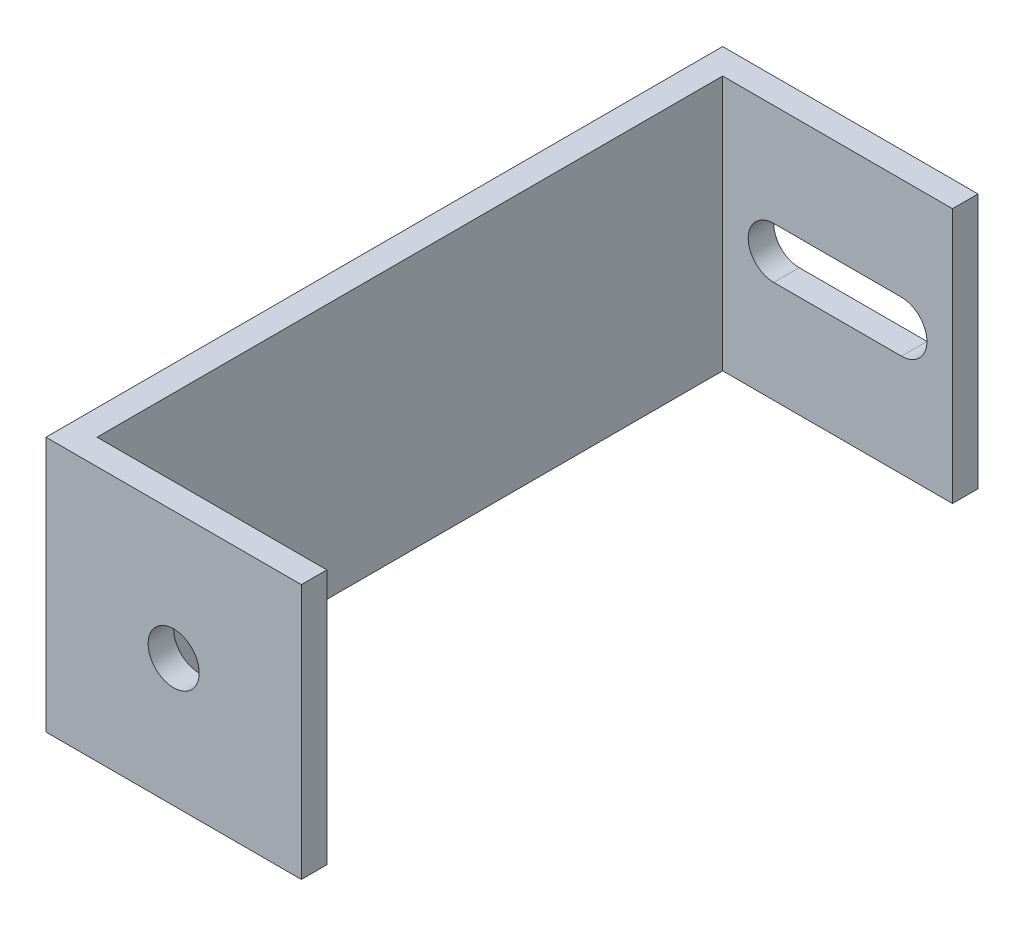
ISO-10303-21;
HEADER;
FILE_DESCRIPTION(('STEP AP214'),'2;1');
FILE_NAME('part.step','',(''),(''),'','','');
FILE_SCHEMA(('AUTOMOTIVE_DESIGN { 1 0 10303 214 1 1 1 1 }'));
ENDSEC;
DATA;
#1=APPLICATION_CONTEXT('core data for automotive mechanical design processes');
#2=APPLICATION_PROTOCOL_DEFINITION('international standard','automotive_design',2000,#1);
#3=PRODUCT_CONTEXT('',#1,'mechanical');
#4=PRODUCT('Part','Part','',(#3));
#5=PRODUCT_RELATED_PRODUCT_CATEGORY('part','',(#4));
#6=PRODUCT_DEFINITION_FORMATION('','',#4);
#7=PRODUCT_DEFINITION_CONTEXT('part definition',#1,'design');
#8=PRODUCT_DEFINITION('design','',#6,#7);
#9=PRODUCT_DEFINITION_SHAPE('','',#8);
#10=(LENGTH_UNIT() NAMED_UNIT(*) SI_UNIT(.MILLI.,.METRE.));
#11=(NAMED_UNIT(*) PLANE_ANGLE_UNIT() SI_UNIT($,.RADIAN.));
#12=(NAMED_UNIT(*) SI_UNIT($,.STERADIAN.) SOLID_ANGLE_UNIT());
#13=UNCERTAINTY_MEASURE_WITH_UNIT(LENGTH_MEASURE(1.E-05),#10,'distance_accuracy_value','');
#14=(GEOMETRIC_REPRESENTATION_CONTEXT(3) GLOBAL_UNCERTAINTY_ASSIGNED_CONTEXT((#13)) GLOBAL_UNIT_ASSIGNED_CONTEXT((#10,
#11,#12)) REPRESENTATION_CONTEXT('',''));
#15=CARTESIAN_POINT('',(0.,0.,0.));
#16=DIRECTION('',(0.,0.,1.));
#17=DIRECTION('',(1.,0.,0.));
#18=AXIS2_PLACEMENT_3D('',#15,#16,#17);
#19=CARTESIAN_POINT('',(-8.,10.,53.));
#20=DIRECTION('',(-1.,0.,0.));
#21=DIRECTION('',(0.,-1.,0.));
#22=AXIS2_PLACEMENT_3D('',#19,#20,#21);
#23=PLANE('',#22);
#24=DIRECTION('',(0.,1.,0.));
#25=VECTOR('',#24,1.);
#26=CARTESIAN_POINT('',(-8.,10.,51.));
#27=LINE('',#26,#25);
#28=CARTESIAN_POINT('',(-8.,-10.,51.));
#29=VERTEX_POINT('',#28);
#30=CARTESIAN_POINT('',(-8.,10.,51.));
#31=VERTEX_POINT('',#30);
#32=EDGE_CURVE('E166',#29,#31,#27,.T.);
#33=ORIENTED_EDGE('',*,*,#32,.F.);
#34=DIRECTION('',(0.,0.,-1.));
#35=VECTOR('',#34,1.);
#36=CARTESIAN_POINT('',(-8.,-10.,53.));
#37=LINE('',#36,#35);
#38=CARTESIAN_POINT('',(-8.,-10.,2.));
#39=VERTEX_POINT('',#38);
#40=EDGE_CURVE('E192',#29,#39,#37,.T.);
#41=ORIENTED_EDGE('',*,*,#40,.T.);
#42=DIRECTION('',(0.,1.,0.));
#43=VECTOR('',#42,1.);
#44=CARTESIAN_POINT('',(-8.,10.,2.));
#45=LINE('',#44,#43);
#46=CARTESIAN_POINT('',(-8.,10.,2.));
#47=VERTEX_POINT('',#46);
#48=EDGE_CURVE('E179',#39,#47,#45,.T.);
#49=ORIENTED_EDGE('',*,*,#48,.T.);
#50=DIRECTION('',(0.,0.,-1.));
#51=VECTOR('',#50,1.);
#52=CARTESIAN_POINT('',(-8.,10.,53.));
#53=LINE('',#52,#51);
#54=EDGE_CURVE('E188',#31,#47,#53,.T.);
#55=ORIENTED_EDGE('',*,*,#54,.F.);
#56=EDGE_LOOP('',(#33,#41,#49,#55));
#57=FACE_BOUND('',#56,.T.);
#58=ADVANCED_FACE('F34',(#57),#23,.F.);
#59=CARTESIAN_POINT('',(10.,10.,2.));
#60=DIRECTION('',(-1.,0.,0.));
#61=DIRECTION('',(0.,-1.,0.));
#62=AXIS2_PLACEMENT_3D('',#59,#60,#61);
#63=PLANE('',#62);
#64=DIRECTION('',(0.,1.,0.));
#65=VECTOR('',#64,1.);
#66=CARTESIAN_POINT('',(10.,10.,0.));
#67=LINE('',#66,#65);
#68=CARTESIAN_POINT('',(10.,-10.,0.));
#69=VERTEX_POINT('',#68);
#70=CARTESIAN_POINT('',(10.,10.,0.));
#71=VERTEX_POINT('',#70);
#72=EDGE_CURVE('E194',#69,#71,#67,.T.);
#73=ORIENTED_EDGE('',*,*,#72,.T.);
#74=DIRECTION('',(0.,0.,-1.));
#75=VECTOR('',#74,1.);
#76=CARTESIAN_POINT('',(10.,10.,2.));
#77=LINE('',#76,#75);
#78=CARTESIAN_POINT('',(10.,10.,2.));
#79=VERTEX_POINT('',#78);
#80=EDGE_CURVE('E11',#79,#71,#77,.T.);
#81=ORIENTED_EDGE('',*,*,#80,.F.);
#82=DIRECTION('',(0.,1.,0.));
#83=VECTOR('',#82,1.);
#84=CARTESIAN_POINT('',(10.,10.,2.));
#85=LINE('',#84,#83);
#86=CARTESIAN_POINT('',(10.,-10.,2.));
#87=VERTEX_POINT('',#86);
#88=EDGE_CURVE('E195',#87,#79,#85,.T.);
#89=ORIENTED_EDGE('',*,*,#88,.F.);
#90=DIRECTION('',(0.,0.,-1.));
#91=VECTOR('',#90,1.);
#92=CARTESIAN_POINT('',(10.,-10.,2.));
#93=LINE('',#92,#91);
#94=EDGE_CURVE('E204',#87,#69,#93,.T.);
#95=ORIENTED_EDGE('',*,*,#94,.T.);
#96=EDGE_LOOP('',(#73,#81,#89,#95));
#97=FACE_BOUND('',#96,.T.);
#98=ADVANCED_FACE('F36',(#97),#63,.F.);
#99=CARTESIAN_POINT('',(-10.,10.,2.));
#100=DIRECTION('',(0.,-1.,0.));
#101=DIRECTION('',(0.,0.,-1.));
#102=AXIS2_PLACEMENT_3D('',#99,#100,#101);
#103=PLANE('',#102);
#104=DIRECTION('',(-1.,0.,0.));
#105=VECTOR('',#104,1.);
#106=CARTESIAN_POINT('',(-10.,10.,0.));
#107=LINE('',#106,#105);
#108=CARTESIAN_POINT('',(-10.,10.,0.));
#109=VERTEX_POINT('',#108);
#110=EDGE_CURVE('E207',#71,#109,#107,.T.);
#111=ORIENTED_EDGE('',*,*,#110,.T.);
#112=DIRECTION('',(0.,0.,-1.));
#113=VECTOR('',#112,1.);
#114=CARTESIAN_POINT('',(-10.,10.,2.));
#115=LINE('',#114,#113);
#116=CARTESIAN_POINT('',(-10.,10.,53.));
#117=VERTEX_POINT('',#116);
#118=EDGE_CURVE('E43',#117,#109,#115,.T.);
#119=ORIENTED_EDGE('',*,*,#118,.F.);
#120=DIRECTION('',(-1.,0.,0.));
#121=VECTOR('',#120,1.);
#122=CARTESIAN_POINT('',(-10.,10.,53.));
#123=LINE('',#122,#121);
#124=CARTESIAN_POINT('',(10.,10.,53.));
#125=VERTEX_POINT('',#124);
#126=EDGE_CURVE('E185',#125,#117,#123,.T.);
#127=ORIENTED_EDGE('',*,*,#126,.F.);
#128=DIRECTION('',(0.,0.,1.));
#129=VECTOR('',#128,1.);
#130=CARTESIAN_POINT('',(10.,10.,53.));
#131=LINE('',#130,#129);
#132=CARTESIAN_POINT('',(10.,10.,51.));
#133=VERTEX_POINT('',#132);
#134=EDGE_CURVE('E170',#133,#125,#131,.T.);
#135=ORIENTED_EDGE('',*,*,#134,.F.);
#136=DIRECTION('',(-1.,0.,0.));
#137=VECTOR('',#136,1.);
#138=CARTESIAN_POINT('',(10.,10.,51.));
#139=LINE('',#138,#137);
#140=EDGE_CURVE('E173',#133,#31,#139,.T.);
#141=ORIENTED_EDGE('',*,*,#140,.T.);
#142=ORIENTED_EDGE('',*,*,#54,.T.);
#143=DIRECTION('',(-1.,0.,0.));
#144=VECTOR('',#143,1.);
#145=CARTESIAN_POINT('',(-10.,10.,2.));
#146=LINE('',#145,#144);
#147=EDGE_CURVE('E198',#79,#47,#146,.T.);
#148=ORIENTED_EDGE('',*,*,#147,.F.);
#149=ORIENTED_EDGE('',*,*,#80,.T.);
#150=EDGE_LOOP('',(#111,#119,#127,#135,#141,#142,#148,#149));
#151=FACE_BOUND('',#150,.T.);
#152=ADVANCED_FACE('F247',(#151),#103,.F.);
#153=CARTESIAN_POINT('',(-10.,10.,2.));
#154=DIRECTION('',(1.,0.,0.));
#155=DIRECTION('',(0.,1.,0.));
#156=AXIS2_PLACEMENT_3D('',#153,#154,#155);
#157=PLANE('',#156);
#158=DIRECTION('',(0.,-1.,0.));
#159=VECTOR('',#158,1.);
#160=CARTESIAN_POINT('',(-10.,10.,0.));
#161=LINE('',#160,#159);
#162=CARTESIAN_POINT('',(-10.,-10.,0.));
#163=VERTEX_POINT('',#162);
#164=EDGE_CURVE('E209',#109,#163,#161,.T.);
#165=ORIENTED_EDGE('',*,*,#164,.T.);
#166=DIRECTION('',(0.,0.,-1.));
#167=VECTOR('',#166,1.);
#168=CARTESIAN_POINT('',(-10.,-10.,2.));
#169=LINE('',#168,#167);
#170=CARTESIAN_POINT('',(-10.,-10.,53.));
#171=VERTEX_POINT('',#170);
#172=EDGE_CURVE('E214',#171,#163,#169,.T.);
#173=ORIENTED_EDGE('',*,*,#172,.F.);
#174=DIRECTION('',(0.,-1.,0.));
#175=VECTOR('',#174,1.);
#176=CARTESIAN_POINT('',(-10.,10.,53.));
#177=LINE('',#176,#175);
#178=EDGE_CURVE('E180',#117,#171,#177,.T.);
#179=ORIENTED_EDGE('',*,*,#178,.F.);
#180=ORIENTED_EDGE('',*,*,#118,.T.);
#181=EDGE_LOOP('',(#165,#173,#179,#180));
#182=FACE_BOUND('',#181,.T.);
#183=ADVANCED_FACE('F221',(#182),#157,.F.);
#184=CARTESIAN_POINT('',(-10.,-10.,2.));
#185=DIRECTION('',(0.,1.,0.));
#186=DIRECTION('',(0.,0.,1.));
#187=AXIS2_PLACEMENT_3D('',#184,#185,#186);
#188=PLANE('',#187);
#189=DIRECTION('',(1.,0.,0.));
#190=VECTOR('',#189,1.);
#191=CARTESIAN_POINT('',(-10.,-10.,0.));
#192=LINE('',#191,#190);
#193=EDGE_CURVE('E199',#163,#69,#192,.T.);
#194=ORIENTED_EDGE('',*,*,#193,.T.);
#195=ORIENTED_EDGE('',*,*,#94,.F.);
#196=DIRECTION('',(1.,0.,0.));
#197=VECTOR('',#196,1.);
#198=CARTESIAN_POINT('',(-10.,-10.,2.));
#199=LINE('',#198,#197);
#200=EDGE_CURVE('E202',#39,#87,#199,.T.);
#201=ORIENTED_EDGE('',*,*,#200,.F.);
#202=ORIENTED_EDGE('',*,*,#40,.F.);
#203=DIRECTION('',(-1.,0.,0.));
#204=VECTOR('',#203,1.);
#205=CARTESIAN_POINT('',(10.,-10.,51.));
#206=LINE('',#205,#204);
#207=CARTESIAN_POINT('',(10.,-10.,51.));
#208=VERTEX_POINT('',#207);
#209=EDGE_CURVE('E177',#208,#29,#206,.T.);
#210=ORIENTED_EDGE('',*,*,#209,.F.);
#211=DIRECTION('',(0.,0.,-1.));
#212=VECTOR('',#211,1.);
#213=CARTESIAN_POINT('',(10.,-10.,53.));
#214=LINE('',#213,#212);
#215=CARTESIAN_POINT('',(10.,-10.,53.));
#216=VERTEX_POINT('',#215);
#217=EDGE_CURVE('E165',#216,#208,#214,.T.);
#218=ORIENTED_EDGE('',*,*,#217,.F.);
#219=DIRECTION('',(1.,0.,0.));
#220=VECTOR('',#219,1.);
#221=CARTESIAN_POINT('',(-10.,-10.,53.));
#222=LINE('',#221,#220);
#223=EDGE_CURVE('E183',#171,#216,#222,.T.);
#224=ORIENTED_EDGE('',*,*,#223,.F.);
#225=ORIENTED_EDGE('',*,*,#172,.T.);
#226=EDGE_LOOP('',(#194,#195,#201,#202,#210,#218,#224,#225));
#227=FACE_BOUND('',#226,.T.);
#228=ADVANCED_FACE('F227',(#227),#188,.F.);
#229=CARTESIAN_POINT('',(0.,0.,2.));
#230=DIRECTION('',(0.,0.,1.));
#231=DIRECTION('',(1.,0.,0.));
#232=AXIS2_PLACEMENT_3D('',#229,#230,#231);
#233=PLANE('',#232);
#234=CARTESIAN_POINT('',(6.,0.,2.));
#235=DIRECTION('',(0.,0.,1.));
#236=DIRECTION('',(1.,0.,0.));
#237=AXIS2_PLACEMENT_3D('',#234,#235,#236);
#238=CIRCLE('',#237,2.);
#239=CARTESIAN_POINT('',(6.,-2.,2.));
#240=VERTEX_POINT('',#239);
#241=CARTESIAN_POINT('',(6.,2.,2.));
#242=VERTEX_POINT('',#241);
#243=EDGE_CURVE('E157',#240,#242,#238,.T.);
#244=ORIENTED_EDGE('',*,*,#243,.F.);
#245=DIRECTION('',(1.,0.,0.));
#246=VECTOR('',#245,1.);
#247=CARTESIAN_POINT('',(0.,-2.,2.));
#248=LINE('',#247,#246);
#249=CARTESIAN_POINT('',(-4.,-2.,2.));
#250=VERTEX_POINT('',#249);
#251=EDGE_CURVE('E150',#250,#240,#248,.T.);
#252=ORIENTED_EDGE('',*,*,#251,.F.);
#253=CARTESIAN_POINT('',(-4.,0.,2.));
#254=DIRECTION('',(0.,0.,1.));
#255=DIRECTION('',(1.,0.,0.));
#256=AXIS2_PLACEMENT_3D('',#253,#254,#255);
#257=CIRCLE('',#256,2.);
#258=CARTESIAN_POINT('',(-4.,2.,2.));
#259=VERTEX_POINT('',#258);
#260=EDGE_CURVE('E130',#259,#250,#257,.T.);
#261=ORIENTED_EDGE('',*,*,#260,.F.);
#262=DIRECTION('',(-1.,0.,0.));
#263=VECTOR('',#262,1.);
#264=CARTESIAN_POINT('',(0.,2.,2.));
#265=LINE('',#264,#263);
#266=EDGE_CURVE('E155',#242,#259,#265,.T.);
#267=ORIENTED_EDGE('',*,*,#266,.F.);
#268=EDGE_LOOP('',(#244,#252,#261,#267));
#269=FACE_BOUND('',#268,.T.);
#270=ORIENTED_EDGE('',*,*,#48,.F.);
#271=ORIENTED_EDGE('',*,*,#200,.T.);
#272=ORIENTED_EDGE('',*,*,#88,.T.);
#273=ORIENTED_EDGE('',*,*,#147,.T.);
#274=EDGE_LOOP('',(#270,#271,#272,#273));
#275=FACE_BOUND('',#274,.T.);
#276=ADVANCED_FACE('F235',(#269,#275),#233,.T.);
#277=CARTESIAN_POINT('',(0.,0.,0.));
#278=DIRECTION('',(0.,0.,1.));
#279=DIRECTION('',(1.,0.,0.));
#280=AXIS2_PLACEMENT_3D('',#277,#278,#279);
#281=PLANE('',#280);
#282=DIRECTION('',(-1.,0.,0.));
#283=VECTOR('',#282,1.);
#284=CARTESIAN_POINT('',(6.,-2.,0.));
#285=LINE('',#284,#283);
#286=CARTESIAN_POINT('',(6.,-2.,0.));
#287=VERTEX_POINT('',#286);
#288=CARTESIAN_POINT('',(-4.,-2.,0.));
#289=VERTEX_POINT('',#288);
#290=EDGE_CURVE('E136',#287,#289,#285,.T.);
#291=ORIENTED_EDGE('',*,*,#290,.F.);
#292=CARTESIAN_POINT('',(6.,0.,0.));
#293=DIRECTION('',(0.,0.,-1.));
#294=DIRECTION('',(-1.,0.,0.));
#295=AXIS2_PLACEMENT_3D('',#292,#293,#294);
#296=CIRCLE('',#295,2.);
#297=CARTESIAN_POINT('',(6.,2.,0.));
#298=VERTEX_POINT('',#297);
#299=EDGE_CURVE('E58',#298,#287,#296,.T.);
#300=ORIENTED_EDGE('',*,*,#299,.F.);
#301=DIRECTION('',(1.,0.,0.));
#302=VECTOR('',#301,1.);
#303=CARTESIAN_POINT('',(6.,2.,0.));
#304=LINE('',#303,#302);
#305=CARTESIAN_POINT('',(-4.,2.,0.));
#306=VERTEX_POINT('',#305);
#307=EDGE_CURVE('E143',#306,#298,#304,.T.);
#308=ORIENTED_EDGE('',*,*,#307,.F.);
#309=CARTESIAN_POINT('',(-4.,0.,0.));
#310=DIRECTION('',(0.,0.,-1.));
#311=DIRECTION('',(-1.,0.,0.));
#312=AXIS2_PLACEMENT_3D('',#309,#310,#311);
#313=CIRCLE('',#312,2.);
#314=EDGE_CURVE('E127',#289,#306,#313,.T.);
#315=ORIENTED_EDGE('',*,*,#314,.F.);
#316=EDGE_LOOP('',(#291,#300,#308,#315));
#317=FACE_BOUND('',#316,.T.);
#318=ORIENTED_EDGE('',*,*,#72,.F.);
#319=ORIENTED_EDGE('',*,*,#193,.F.);
#320=ORIENTED_EDGE('',*,*,#164,.F.);
#321=ORIENTED_EDGE('',*,*,#110,.F.);
#322=EDGE_LOOP('',(#318,#319,#320,#321));
#323=FACE_BOUND('',#322,.T.);
#324=ADVANCED_FACE('F140',(#317,#323),#281,.F.);
#325=CARTESIAN_POINT('',(0.,0.,53.));
#326=DIRECTION('',(0.,0.,1.));
#327=DIRECTION('',(1.,0.,0.));
#328=AXIS2_PLACEMENT_3D('',#325,#326,#327);
#329=PLANE('',#328);
#330=CARTESIAN_POINT('',(0.,0.,53.));
#331=DIRECTION('',(0.,0.,1.));
#332=DIRECTION('',(1.,0.,0.));
#333=AXIS2_PLACEMENT_3D('',#330,#331,#332);
#334=CIRCLE('',#333,2.);
#335=CARTESIAN_POINT('',(2.,0.,53.));
#336=VERTEX_POINT('',#335);
#337=EDGE_CURVE('E159',#336,#336,#334,.T.);
#338=ORIENTED_EDGE('',*,*,#337,.F.);
#339=EDGE_LOOP('',(#338));
#340=FACE_BOUND('',#339,.T.);
#341=ORIENTED_EDGE('',*,*,#178,.T.);
#342=ORIENTED_EDGE('',*,*,#223,.T.);
#343=DIRECTION('',(0.,-1.,0.));
#344=VECTOR('',#343,1.);
#345=CARTESIAN_POINT('',(10.,10.,53.));
#346=LINE('',#345,#344);
#347=EDGE_CURVE('E162',#125,#216,#346,.T.);
#348=ORIENTED_EDGE('',*,*,#347,.F.);
#349=ORIENTED_EDGE('',*,*,#126,.T.);
#350=EDGE_LOOP('',(#341,#342,#348,#349));
#351=FACE_BOUND('',#350,.T.);
#352=ADVANCED_FACE('F252',(#340,#351),#329,.T.);
#353=CARTESIAN_POINT('',(10.,10.,51.));
#354=DIRECTION('',(0.,0.,1.));
#355=DIRECTION('',(1.,0.,0.));
#356=AXIS2_PLACEMENT_3D('',#353,#354,#355);
#357=PLANE('',#356);
#358=CARTESIAN_POINT('',(0.,0.,51.));
#359=DIRECTION('',(0.,0.,1.));
#360=DIRECTION('',(1.,0.,0.));
#361=AXIS2_PLACEMENT_3D('',#358,#359,#360);
#362=CIRCLE('',#361,2.);
#363=CARTESIAN_POINT('',(2.,0.,51.));
#364=VERTEX_POINT('',#363);
#365=EDGE_CURVE('E38',#364,#364,#362,.T.);
#366=ORIENTED_EDGE('',*,*,#365,.T.);
#367=EDGE_LOOP('',(#366));
#368=FACE_BOUND('',#367,.T.);
#369=ORIENTED_EDGE('',*,*,#32,.T.);
#370=ORIENTED_EDGE('',*,*,#140,.F.);
#371=DIRECTION('',(0.,1.,0.));
#372=VECTOR('',#371,1.);
#373=CARTESIAN_POINT('',(10.,10.,51.));
#374=LINE('',#373,#372);
#375=EDGE_CURVE('E168',#208,#133,#374,.T.);
#376=ORIENTED_EDGE('',*,*,#375,.F.);
#377=ORIENTED_EDGE('',*,*,#209,.T.);
#378=EDGE_LOOP('',(#369,#370,#376,#377));
#379=FACE_BOUND('',#378,.T.);
#380=ADVANCED_FACE('F245',(#368,#379),#357,.F.);
#381=CARTESIAN_POINT('',(10.,0.,0.));
#382=DIRECTION('',(1.,0.,0.));
#383=DIRECTION('',(0.,0.,-1.));
#384=AXIS2_PLACEMENT_3D('',#381,#382,#383);
#385=PLANE('',#384);
#386=ORIENTED_EDGE('',*,*,#347,.T.);
#387=ORIENTED_EDGE('',*,*,#217,.T.);
#388=ORIENTED_EDGE('',*,*,#375,.T.);
#389=ORIENTED_EDGE('',*,*,#134,.T.);
#390=EDGE_LOOP('',(#386,#387,#388,#389));
#391=FACE_BOUND('',#390,.T.);
#392=ADVANCED_FACE('F250',(#391),#385,.T.);
#393=CARTESIAN_POINT('',(0.,0.,35.));
#394=DIRECTION('',(0.,0.,1.));
#395=DIRECTION('',(1.,0.,0.));
#396=AXIS2_PLACEMENT_3D('',#393,#394,#395);
#397=CYLINDRICAL_SURFACE('',#396,2.);
#398=ORIENTED_EDGE('',*,*,#337,.T.);
#399=EDGE_LOOP('',(#398));
#400=FACE_BOUND('',#399,.T.);
#401=ORIENTED_EDGE('',*,*,#365,.F.);
#402=EDGE_LOOP('',(#401));
#403=FACE_BOUND('',#402,.T.);
#404=ADVANCED_FACE('F311',(#400,#403),#397,.F.);
#405=CARTESIAN_POINT('',(6.,0.,18.));
#406=DIRECTION('',(0.,0.,-1.));
#407=DIRECTION('',(-1.,0.,0.));
#408=AXIS2_PLACEMENT_3D('',#405,#406,#407);
#409=CYLINDRICAL_SURFACE('',#408,2.);
#410=ORIENTED_EDGE('',*,*,#243,.T.);
#411=DIRECTION('',(0.,0.,-1.));
#412=VECTOR('',#411,1.);
#413=CARTESIAN_POINT('',(6.,2.,18.));
#414=LINE('',#413,#412);
#415=EDGE_CURVE('E148',#242,#298,#414,.T.);
#416=ORIENTED_EDGE('',*,*,#415,.T.);
#417=ORIENTED_EDGE('',*,*,#299,.T.);
#418=DIRECTION('',(0.,0.,-1.));
#419=VECTOR('',#418,1.);
#420=CARTESIAN_POINT('',(6.,-2.,18.));
#421=LINE('',#420,#419);
#422=EDGE_CURVE('E133',#240,#287,#421,.T.);
#423=ORIENTED_EDGE('',*,*,#422,.F.);
#424=EDGE_LOOP('',(#410,#416,#417,#423));
#425=FACE_BOUND('',#424,.T.);
#426=ADVANCED_FACE('F305',(#425),#409,.F.);
#427=CARTESIAN_POINT('',(6.,2.,18.));
#428=DIRECTION('',(0.,1.,0.));
#429=DIRECTION('',(0.,0.,1.));
#430=AXIS2_PLACEMENT_3D('',#427,#428,#429);
#431=PLANE('',#430);
#432=ORIENTED_EDGE('',*,*,#266,.T.);
#433=DIRECTION('',(0.,0.,-1.));
#434=VECTOR('',#433,1.);
#435=CARTESIAN_POINT('',(-4.,2.,18.));
#436=LINE('',#435,#434);
#437=EDGE_CURVE('E132',#259,#306,#436,.T.);
#438=ORIENTED_EDGE('',*,*,#437,.T.);
#439=ORIENTED_EDGE('',*,*,#307,.T.);
#440=ORIENTED_EDGE('',*,*,#415,.F.);
#441=EDGE_LOOP('',(#432,#438,#439,#440));
#442=FACE_BOUND('',#441,.T.);
#443=ADVANCED_FACE('F310',(#442),#431,.F.);
#444=CARTESIAN_POINT('',(-4.,0.,18.));
#445=DIRECTION('',(0.,0.,-1.));
#446=DIRECTION('',(-1.,0.,0.));
#447=AXIS2_PLACEMENT_3D('',#444,#445,#446);
#448=CYLINDRICAL_SURFACE('',#447,2.);
#449=ORIENTED_EDGE('',*,*,#260,.T.);
#450=DIRECTION('',(0.,0.,-1.));
#451=VECTOR('',#450,1.);
#452=CARTESIAN_POINT('',(-4.,-2.,18.));
#453=LINE('',#452,#451);
#454=EDGE_CURVE('E50',#250,#289,#453,.T.);
#455=ORIENTED_EDGE('',*,*,#454,.T.);
#456=ORIENTED_EDGE('',*,*,#314,.T.);
#457=ORIENTED_EDGE('',*,*,#437,.F.);
#458=EDGE_LOOP('',(#449,#455,#456,#457));
#459=FACE_BOUND('',#458,.T.);
#460=ADVANCED_FACE('F124',(#459),#448,.F.);
#461=CARTESIAN_POINT('',(6.,-2.,18.));
#462=DIRECTION('',(0.,-1.,0.));
#463=DIRECTION('',(0.,0.,-1.));
#464=AXIS2_PLACEMENT_3D('',#461,#462,#463);
#465=PLANE('',#464);
#466=ORIENTED_EDGE('',*,*,#251,.T.);
#467=ORIENTED_EDGE('',*,*,#422,.T.);
#468=ORIENTED_EDGE('',*,*,#290,.T.);
#469=ORIENTED_EDGE('',*,*,#454,.F.);
#470=EDGE_LOOP('',(#466,#467,#468,#469));
#471=FACE_BOUND('',#470,.T.);
#472=ADVANCED_FACE('F137',(#471),#465,.F.);
#473=CLOSED_SHELL('',(#58,#98,#152,#183,#228,#276,#324,#352,#380,#392,#404,#426,#443,#460,#472));
#474=MANIFOLD_SOLID_BREP('B2',#473);
#475=ADVANCED_BREP_SHAPE_REPRESENTATION('',(#18,#474),#14);
#476=SHAPE_DEFINITION_REPRESENTATION(#9,#475);
ENDSEC;
END-ISO-10303-21;
